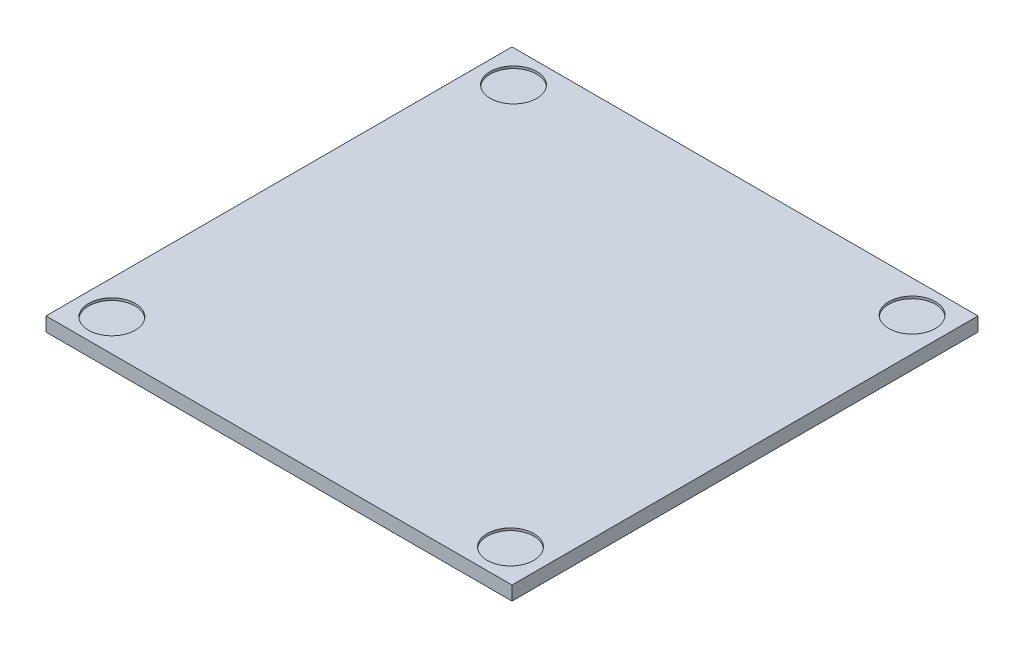
ISO-10303-21;
HEADER;
FILE_DESCRIPTION(('STEP AP214'),'2;1');
FILE_NAME('part.step','',(''),(''),'','','');
FILE_SCHEMA(('AUTOMOTIVE_DESIGN { 1 0 10303 214 1 1 1 1 }'));
ENDSEC;
DATA;
#1=APPLICATION_CONTEXT('core data for automotive mechanical design processes');
#2=APPLICATION_PROTOCOL_DEFINITION('international standard','automotive_design',2000,#1);
#3=PRODUCT_CONTEXT('',#1,'mechanical');
#4=PRODUCT('Part','Part','',(#3));
#5=PRODUCT_RELATED_PRODUCT_CATEGORY('part','',(#4));
#6=PRODUCT_DEFINITION_FORMATION('','',#4);
#7=PRODUCT_DEFINITION_CONTEXT('part definition',#1,'design');
#8=PRODUCT_DEFINITION('design','',#6,#7);
#9=PRODUCT_DEFINITION_SHAPE('','',#8);
#10=(LENGTH_UNIT() NAMED_UNIT(*) SI_UNIT(.MILLI.,.METRE.));
#11=(NAMED_UNIT(*) PLANE_ANGLE_UNIT() SI_UNIT($,.RADIAN.));
#12=(NAMED_UNIT(*) SI_UNIT($,.STERADIAN.) SOLID_ANGLE_UNIT());
#13=UNCERTAINTY_MEASURE_WITH_UNIT(LENGTH_MEASURE(1.E-05),#10,'distance_accuracy_value','');
#14=(GEOMETRIC_REPRESENTATION_CONTEXT(3) GLOBAL_UNCERTAINTY_ASSIGNED_CONTEXT((#13)) GLOBAL_UNIT_ASSIGNED_CONTEXT((#10,
#11,#12)) REPRESENTATION_CONTEXT('',''));
#15=CARTESIAN_POINT('',(0.,0.,0.));
#16=DIRECTION('',(0.,0.,1.));
#17=DIRECTION('',(1.,0.,0.));
#18=AXIS2_PLACEMENT_3D('',#15,#16,#17);
#19=CARTESIAN_POINT('',(0.,29.9999999999997,0.));
#20=DIRECTION('',(1.,0.,0.));
#21=DIRECTION('',(0.,0.,-1.));
#22=AXIS2_PLACEMENT_3D('',#19,#20,#21);
#23=PLANE('',#22);
#24=DIRECTION('',(0.,0.,1.));
#25=VECTOR('',#24,1.);
#26=CARTESIAN_POINT('',(0.,0.,0.));
#27=LINE('',#26,#25);
#28=CARTESIAN_POINT('',(0.,0.,0.));
#29=VERTEX_POINT('',#28);
#30=CARTESIAN_POINT('',(1.22464679914735E-13,0.,1000.));
#31=VERTEX_POINT('',#30);
#32=EDGE_CURVE('E96',#29,#31,#27,.T.);
#33=ORIENTED_EDGE('',*,*,#32,.T.);
#34=DIRECTION('',(0.,-1.,0.));
#35=VECTOR('',#34,1.);
#36=CARTESIAN_POINT('',(1.22464679914735E-13,29.9999999999997,1000.));
#37=LINE('',#36,#35);
#38=CARTESIAN_POINT('',(1.22464679914735E-13,29.9999999999997,1000.));
#39=VERTEX_POINT('',#38);
#40=EDGE_CURVE('E11',#39,#31,#37,.T.);
#41=ORIENTED_EDGE('',*,*,#40,.F.);
#42=DIRECTION('',(0.,0.,1.));
#43=VECTOR('',#42,1.);
#44=CARTESIAN_POINT('',(0.,29.9999999999997,0.));
#45=LINE('',#44,#43);
#46=CARTESIAN_POINT('',(0.,29.9999999999997,0.));
#47=VERTEX_POINT('',#46);
#48=EDGE_CURVE('E84',#47,#39,#45,.T.);
#49=ORIENTED_EDGE('',*,*,#48,.F.);
#50=DIRECTION('',(0.,-1.,0.));
#51=VECTOR('',#50,1.);
#52=CARTESIAN_POINT('',(0.,29.9999999999997,0.));
#53=LINE('',#52,#51);
#54=EDGE_CURVE('E92',#47,#29,#53,.T.);
#55=ORIENTED_EDGE('',*,*,#54,.T.);
#56=EDGE_LOOP('',(#33,#41,#49,#55));
#57=FACE_BOUND('',#56,.T.);
#58=ADVANCED_FACE('F33',(#57),#23,.F.);
#59=CARTESIAN_POINT('',(1.22464679914735E-13,29.9999999999997,1000.));
#60=DIRECTION('',(0.,0.,-1.));
#61=DIRECTION('',(-1.,0.,0.));
#62=AXIS2_PLACEMENT_3D('',#59,#60,#61);
#63=PLANE('',#62);
#64=DIRECTION('',(1.,0.,0.));
#65=VECTOR('',#64,1.);
#66=CARTESIAN_POINT('',(1.22464679914735E-13,0.,1000.));
#67=LINE('',#66,#65);
#68=CARTESIAN_POINT('',(1000.,0.,1000.));
#69=VERTEX_POINT('',#68);
#70=EDGE_CURVE('E88',#31,#69,#67,.T.);
#71=ORIENTED_EDGE('',*,*,#70,.T.);
#72=DIRECTION('',(0.,-1.,0.));
#73=VECTOR('',#72,1.);
#74=CARTESIAN_POINT('',(1000.,29.9999999999997,1000.));
#75=LINE('',#74,#73);
#76=CARTESIAN_POINT('',(1000.,29.9999999999997,1000.));
#77=VERTEX_POINT('',#76);
#78=EDGE_CURVE('E41',#77,#69,#75,.T.);
#79=ORIENTED_EDGE('',*,*,#78,.F.);
#80=DIRECTION('',(1.,0.,0.));
#81=VECTOR('',#80,1.);
#82=CARTESIAN_POINT('',(1.22464679914735E-13,29.9999999999997,1000.));
#83=LINE('',#82,#81);
#84=EDGE_CURVE('E79',#39,#77,#83,.T.);
#85=ORIENTED_EDGE('',*,*,#84,.F.);
#86=ORIENTED_EDGE('',*,*,#40,.T.);
#87=EDGE_LOOP('',(#71,#79,#85,#86));
#88=FACE_BOUND('',#87,.T.);
#89=ADVANCED_FACE('F87',(#88),#63,.F.);
#90=CARTESIAN_POINT('',(1000.,29.9999999999997,0.));
#91=DIRECTION('',(-1.,0.,0.));
#92=DIRECTION('',(0.,0.,1.));
#93=AXIS2_PLACEMENT_3D('',#90,#91,#92);
#94=PLANE('',#93);
#95=DIRECTION('',(0.,0.,-1.));
#96=VECTOR('',#95,1.);
#97=CARTESIAN_POINT('',(1000.,0.,0.));
#98=LINE('',#97,#96);
#99=CARTESIAN_POINT('',(1000.,0.,0.));
#100=VERTEX_POINT('',#99);
#101=EDGE_CURVE('E66',#69,#100,#98,.T.);
#102=ORIENTED_EDGE('',*,*,#101,.T.);
#103=DIRECTION('',(0.,-1.,0.));
#104=VECTOR('',#103,1.);
#105=CARTESIAN_POINT('',(1000.,29.9999999999997,0.));
#106=LINE('',#105,#104);
#107=CARTESIAN_POINT('',(1000.,29.9999999999997,0.));
#108=VERTEX_POINT('',#107);
#109=EDGE_CURVE('E89',#108,#100,#106,.T.);
#110=ORIENTED_EDGE('',*,*,#109,.F.);
#111=DIRECTION('',(0.,0.,-1.));
#112=VECTOR('',#111,1.);
#113=CARTESIAN_POINT('',(1000.,29.9999999999997,0.));
#114=LINE('',#113,#112);
#115=EDGE_CURVE('E82',#77,#108,#114,.T.);
#116=ORIENTED_EDGE('',*,*,#115,.F.);
#117=ORIENTED_EDGE('',*,*,#78,.T.);
#118=EDGE_LOOP('',(#102,#110,#116,#117));
#119=FACE_BOUND('',#118,.T.);
#120=ADVANCED_FACE('F90',(#119),#94,.F.);
#121=CARTESIAN_POINT('',(0.,29.9999999999997,0.));
#122=DIRECTION('',(0.,0.,1.));
#123=DIRECTION('',(1.,0.,0.));
#124=AXIS2_PLACEMENT_3D('',#121,#122,#123);
#125=PLANE('',#124);
#126=DIRECTION('',(-1.,0.,0.));
#127=VECTOR('',#126,1.);
#128=CARTESIAN_POINT('',(0.,0.,0.));
#129=LINE('',#128,#127);
#130=EDGE_CURVE('E72',#100,#29,#129,.T.);
#131=ORIENTED_EDGE('',*,*,#130,.T.);
#132=ORIENTED_EDGE('',*,*,#54,.F.);
#133=DIRECTION('',(-1.,0.,0.));
#134=VECTOR('',#133,1.);
#135=CARTESIAN_POINT('',(0.,29.9999999999997,0.));
#136=LINE('',#135,#134);
#137=EDGE_CURVE('E49',#108,#47,#136,.T.);
#138=ORIENTED_EDGE('',*,*,#137,.F.);
#139=ORIENTED_EDGE('',*,*,#109,.T.);
#140=EDGE_LOOP('',(#131,#132,#138,#139));
#141=FACE_BOUND('',#140,.T.);
#142=ADVANCED_FACE('F104',(#141),#125,.F.);
#143=CARTESIAN_POINT('',(0.,29.9999999999997,0.));
#144=DIRECTION('',(0.,1.,0.));
#145=DIRECTION('',(0.,0.,1.));
#146=AXIS2_PLACEMENT_3D('',#143,#144,#145);
#147=PLANE('',#146);
#148=CARTESIAN_POINT('',(72.3156183636987,29.9999999999997,930.931545980268));
#149=DIRECTION('',(0.,1.,0.));
#150=DIRECTION('',(0.,0.,-1.));
#151=AXIS2_PLACEMENT_3D('',#148,#149,#150);
#152=CIRCLE('',#151,50.);
#153=CARTESIAN_POINT('',(72.3156183636987,29.9999999999997,880.931545980268));
#154=VERTEX_POINT('',#153);
#155=EDGE_CURVE('E116',#154,#154,#152,.T.);
#156=ORIENTED_EDGE('',*,*,#155,.F.);
#157=EDGE_LOOP('',(#156));
#158=FACE_BOUND('',#157,.T.);
#159=CARTESIAN_POINT('',(927.684381636301,29.9999999999997,930.931545980268));
#160=DIRECTION('',(0.,1.,0.));
#161=DIRECTION('',(0.,0.,1.));
#162=AXIS2_PLACEMENT_3D('',#159,#160,#161);
#163=CIRCLE('',#162,49.9999999999999);
#164=CARTESIAN_POINT('',(927.684381636301,29.9999999999997,980.931545980268));
#165=VERTEX_POINT('',#164);
#166=EDGE_CURVE('E122',#165,#165,#163,.T.);
#167=ORIENTED_EDGE('',*,*,#166,.F.);
#168=EDGE_LOOP('',(#167));
#169=FACE_BOUND('',#168,.T.);
#170=CARTESIAN_POINT('',(927.684381636301,29.9999999999997,69.0684540197321));
#171=DIRECTION('',(0.,1.,0.));
#172=DIRECTION('',(0.,0.,-1.));
#173=AXIS2_PLACEMENT_3D('',#170,#171,#172);
#174=CIRCLE('',#173,49.9999999999999);
#175=CARTESIAN_POINT('',(927.684381636301,29.9999999999997,19.0684540197323));
#176=VERTEX_POINT('',#175);
#177=EDGE_CURVE('E128',#176,#176,#174,.T.);
#178=ORIENTED_EDGE('',*,*,#177,.F.);
#179=EDGE_LOOP('',(#178));
#180=FACE_BOUND('',#179,.T.);
#181=CARTESIAN_POINT('',(72.3156183636987,29.9999999999997,69.0684540197323));
#182=DIRECTION('',(0.,1.,0.));
#183=DIRECTION('',(0.,0.,1.));
#184=AXIS2_PLACEMENT_3D('',#181,#182,#183);
#185=CIRCLE('',#184,50.);
#186=CARTESIAN_POINT('',(72.3156183636987,29.9999999999997,119.068454019732));
#187=VERTEX_POINT('',#186);
#188=EDGE_CURVE('E110',#187,#187,#185,.T.);
#189=ORIENTED_EDGE('',*,*,#188,.F.);
#190=EDGE_LOOP('',(#189));
#191=FACE_BOUND('',#190,.T.);
#192=ORIENTED_EDGE('',*,*,#48,.T.);
#193=ORIENTED_EDGE('',*,*,#84,.T.);
#194=ORIENTED_EDGE('',*,*,#115,.T.);
#195=ORIENTED_EDGE('',*,*,#137,.T.);
#196=EDGE_LOOP('',(#192,#193,#194,#195));
#197=FACE_BOUND('',#196,.T.);
#198=ADVANCED_FACE('F80',(#158,#169,#180,#191,#197),#147,.T.);
#199=CARTESIAN_POINT('',(0.,0.,0.));
#200=DIRECTION('',(0.,1.,0.));
#201=DIRECTION('',(0.,0.,1.));
#202=AXIS2_PLACEMENT_3D('',#199,#200,#201);
#203=PLANE('',#202);
#204=ORIENTED_EDGE('',*,*,#32,.F.);
#205=ORIENTED_EDGE('',*,*,#130,.F.);
#206=ORIENTED_EDGE('',*,*,#101,.F.);
#207=ORIENTED_EDGE('',*,*,#70,.F.);
#208=EDGE_LOOP('',(#204,#205,#206,#207));
#209=FACE_BOUND('',#208,.T.);
#210=ADVANCED_FACE('F107',(#209),#203,.F.);
#211=CARTESIAN_POINT('',(72.3156183636987,24.9999999999997,69.0684540197323));
#212=DIRECTION('',(0.,1.,0.));
#213=DIRECTION('',(0.,0.,1.));
#214=AXIS2_PLACEMENT_3D('',#211,#212,#213);
#215=CYLINDRICAL_SURFACE('',#214,50.);
#216=CARTESIAN_POINT('',(72.3156183636987,24.9999999999997,69.0684540197323));
#217=DIRECTION('',(0.,1.,0.));
#218=DIRECTION('',(0.,0.,1.));
#219=AXIS2_PLACEMENT_3D('',#216,#217,#218);
#220=CIRCLE('',#219,50.);
#221=CARTESIAN_POINT('',(72.3156183636987,24.9999999999997,119.068454019732));
#222=VERTEX_POINT('',#221);
#223=EDGE_CURVE('E99',#222,#222,#220,.T.);
#224=ORIENTED_EDGE('',*,*,#223,.F.);
#225=EDGE_LOOP('',(#224));
#226=FACE_BOUND('',#225,.T.);
#227=ORIENTED_EDGE('',*,*,#188,.T.);
#228=EDGE_LOOP('',(#227));
#229=FACE_BOUND('',#228,.T.);
#230=ADVANCED_FACE('F149',(#226,#229),#215,.F.);
#231=CARTESIAN_POINT('',(72.3156183636987,24.9999999999997,69.0684540197323));
#232=DIRECTION('',(0.,1.,0.));
#233=DIRECTION('',(0.,0.,1.));
#234=AXIS2_PLACEMENT_3D('',#231,#232,#233);
#235=PLANE('',#234);
#236=ORIENTED_EDGE('',*,*,#223,.T.);
#237=EDGE_LOOP('',(#236));
#238=FACE_BOUND('',#237,.T.);
#239=ADVANCED_FACE('F139',(#238),#235,.T.);
#240=CARTESIAN_POINT('',(927.684381636301,24.9999999999997,69.0684540197321));
#241=DIRECTION('',(0.,1.,0.));
#242=DIRECTION('',(0.,0.,1.));
#243=AXIS2_PLACEMENT_3D('',#240,#241,#242);
#244=CYLINDRICAL_SURFACE('',#243,49.9999999999999);
#245=CARTESIAN_POINT('',(927.684381636301,24.9999999999997,69.0684540197321));
#246=DIRECTION('',(0.,1.,0.));
#247=DIRECTION('',(0.,0.,-1.));
#248=AXIS2_PLACEMENT_3D('',#245,#246,#247);
#249=CIRCLE('',#248,49.9999999999999);
#250=CARTESIAN_POINT('',(927.684381636301,24.9999999999997,19.0684540197323));
#251=VERTEX_POINT('',#250);
#252=EDGE_CURVE('E113',#251,#251,#249,.T.);
#253=ORIENTED_EDGE('',*,*,#252,.F.);
#254=EDGE_LOOP('',(#253));
#255=FACE_BOUND('',#254,.T.);
#256=ORIENTED_EDGE('',*,*,#177,.T.);
#257=EDGE_LOOP('',(#256));
#258=FACE_BOUND('',#257,.T.);
#259=ADVANCED_FACE('F136',(#255,#258),#244,.F.);
#260=CARTESIAN_POINT('',(927.684381636301,24.9999999999997,69.0684540197321));
#261=DIRECTION('',(0.,-1.,0.));
#262=DIRECTION('',(0.,0.,-1.));
#263=AXIS2_PLACEMENT_3D('',#260,#261,#262);
#264=PLANE('',#263);
#265=ORIENTED_EDGE('',*,*,#252,.T.);
#266=EDGE_LOOP('',(#265));
#267=FACE_BOUND('',#266,.T.);
#268=ADVANCED_FACE('F134',(#267),#264,.F.);
#269=CARTESIAN_POINT('',(927.684381636301,24.9999999999997,930.931545980268));
#270=DIRECTION('',(0.,1.,0.));
#271=DIRECTION('',(0.,0.,1.));
#272=AXIS2_PLACEMENT_3D('',#269,#270,#271);
#273=CYLINDRICAL_SURFACE('',#272,49.9999999999999);
#274=CARTESIAN_POINT('',(927.684381636301,24.9999999999997,930.931545980268));
#275=DIRECTION('',(0.,1.,0.));
#276=DIRECTION('',(0.,0.,1.));
#277=AXIS2_PLACEMENT_3D('',#274,#275,#276);
#278=CIRCLE('',#277,49.9999999999999);
#279=CARTESIAN_POINT('',(927.684381636301,24.9999999999997,980.931545980268));
#280=VERTEX_POINT('',#279);
#281=EDGE_CURVE('E125',#280,#280,#278,.T.);
#282=ORIENTED_EDGE('',*,*,#281,.F.);
#283=EDGE_LOOP('',(#282));
#284=FACE_BOUND('',#283,.T.);
#285=ORIENTED_EDGE('',*,*,#166,.T.);
#286=EDGE_LOOP('',(#285));
#287=FACE_BOUND('',#286,.T.);
#288=ADVANCED_FACE('F209',(#284,#287),#273,.F.);
#289=CARTESIAN_POINT('',(927.684381636301,24.9999999999997,930.931545980268));
#290=DIRECTION('',(0.,1.,0.));
#291=DIRECTION('',(0.,0.,1.));
#292=AXIS2_PLACEMENT_3D('',#289,#290,#291);
#293=PLANE('',#292);
#294=ORIENTED_EDGE('',*,*,#281,.T.);
#295=EDGE_LOOP('',(#294));
#296=FACE_BOUND('',#295,.T.);
#297=ADVANCED_FACE('F217',(#296),#293,.T.);
#298=CARTESIAN_POINT('',(72.3156183636987,24.9999999999997,930.931545980268));
#299=DIRECTION('',(0.,1.,0.));
#300=DIRECTION('',(0.,0.,1.));
#301=AXIS2_PLACEMENT_3D('',#298,#299,#300);
#302=CYLINDRICAL_SURFACE('',#301,50.);
#303=CARTESIAN_POINT('',(72.3156183636987,24.9999999999997,930.931545980268));
#304=DIRECTION('',(0.,1.,0.));
#305=DIRECTION('',(0.,0.,-1.));
#306=AXIS2_PLACEMENT_3D('',#303,#304,#305);
#307=CIRCLE('',#306,50.);
#308=CARTESIAN_POINT('',(72.3156183636987,24.9999999999997,880.931545980268));
#309=VERTEX_POINT('',#308);
#310=EDGE_CURVE('E119',#309,#309,#307,.T.);
#311=ORIENTED_EDGE('',*,*,#310,.F.);
#312=EDGE_LOOP('',(#311));
#313=FACE_BOUND('',#312,.T.);
#314=ORIENTED_EDGE('',*,*,#155,.T.);
#315=EDGE_LOOP('',(#314));
#316=FACE_BOUND('',#315,.T.);
#317=ADVANCED_FACE('F226',(#313,#316),#302,.F.);
#318=CARTESIAN_POINT('',(72.3156183636987,24.9999999999997,930.931545980268));
#319=DIRECTION('',(0.,-1.,0.));
#320=DIRECTION('',(0.,0.,-1.));
#321=AXIS2_PLACEMENT_3D('',#318,#319,#320);
#322=PLANE('',#321);
#323=ORIENTED_EDGE('',*,*,#310,.T.);
#324=EDGE_LOOP('',(#323));
#325=FACE_BOUND('',#324,.T.);
#326=ADVANCED_FACE('F235',(#325),#322,.F.);
#327=CLOSED_SHELL('',(#58,#89,#120,#142,#198,#210,#230,#239,#259,#268,#288,#297,#317,#326));
#328=MANIFOLD_SOLID_BREP('B2',#327);
#329=ADVANCED_BREP_SHAPE_REPRESENTATION('',(#18,#328),#14);
#330=SHAPE_DEFINITION_REPRESENTATION(#9,#329);
ENDSEC;
END-ISO-10303-21;
